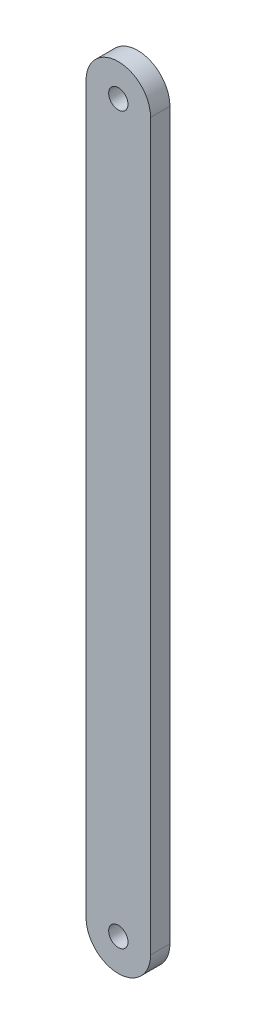
ISO-10303-21;
HEADER;
FILE_DESCRIPTION(('STEP AP214'),'2;1');
FILE_NAME('part.step','',(''),(''),'','','');
FILE_SCHEMA(('AUTOMOTIVE_DESIGN { 1 0 10303 214 1 1 1 1 }'));
ENDSEC;
DATA;
#1=APPLICATION_CONTEXT('core data for automotive mechanical design processes');
#2=APPLICATION_PROTOCOL_DEFINITION('international standard','automotive_design',2000,#1);
#3=PRODUCT_CONTEXT('',#1,'mechanical');
#4=PRODUCT('Part','Part','',(#3));
#5=PRODUCT_RELATED_PRODUCT_CATEGORY('part','',(#4));
#6=PRODUCT_DEFINITION_FORMATION('','',#4);
#7=PRODUCT_DEFINITION_CONTEXT('part definition',#1,'design');
#8=PRODUCT_DEFINITION('design','',#6,#7);
#9=PRODUCT_DEFINITION_SHAPE('','',#8);
#10=(LENGTH_UNIT() NAMED_UNIT(*) SI_UNIT(.MILLI.,.METRE.));
#11=(NAMED_UNIT(*) PLANE_ANGLE_UNIT() SI_UNIT($,.RADIAN.));
#12=(NAMED_UNIT(*) SI_UNIT($,.STERADIAN.) SOLID_ANGLE_UNIT());
#13=UNCERTAINTY_MEASURE_WITH_UNIT(LENGTH_MEASURE(1.E-05),#10,'distance_accuracy_value','');
#14=(GEOMETRIC_REPRESENTATION_CONTEXT(3) GLOBAL_UNCERTAINTY_ASSIGNED_CONTEXT((#13)) GLOBAL_UNIT_ASSIGNED_CONTEXT((#10,
#11,#12)) REPRESENTATION_CONTEXT('',''));
#15=CARTESIAN_POINT('',(0.,0.,0.));
#16=DIRECTION('',(0.,0.,1.));
#17=DIRECTION('',(1.,0.,0.));
#18=AXIS2_PLACEMENT_3D('',#15,#16,#17);
#19=CARTESIAN_POINT('',(0.,0.,6.));
#20=DIRECTION('',(0.,0.,-1.));
#21=DIRECTION('',(-1.,0.,0.));
#22=AXIS2_PLACEMENT_3D('',#19,#20,#21);
#23=CYLINDRICAL_SURFACE('',#22,10.);
#24=CARTESIAN_POINT('',(0.,0.,0.));
#25=DIRECTION('',(0.,0.,1.));
#26=DIRECTION('',(1.,0.,0.));
#27=AXIS2_PLACEMENT_3D('',#24,#25,#26);
#28=CIRCLE('',#27,10.);
#29=CARTESIAN_POINT('',(-10.,0.,0.));
#30=VERTEX_POINT('',#29);
#31=CARTESIAN_POINT('',(10.,0.,0.));
#32=VERTEX_POINT('',#31);
#33=EDGE_CURVE('E96',#30,#32,#28,.T.);
#34=ORIENTED_EDGE('',*,*,#33,.T.);
#35=DIRECTION('',(0.,0.,-1.));
#36=VECTOR('',#35,1.);
#37=CARTESIAN_POINT('',(10.,0.,6.));
#38=LINE('',#37,#36);
#39=CARTESIAN_POINT('',(10.,0.,6.));
#40=VERTEX_POINT('',#39);
#41=EDGE_CURVE('E11',#40,#32,#38,.T.);
#42=ORIENTED_EDGE('',*,*,#41,.F.);
#43=CARTESIAN_POINT('',(0.,0.,6.));
#44=DIRECTION('',(0.,0.,1.));
#45=DIRECTION('',(1.,0.,0.));
#46=AXIS2_PLACEMENT_3D('',#43,#44,#45);
#47=CIRCLE('',#46,10.);
#48=CARTESIAN_POINT('',(-10.,0.,6.));
#49=VERTEX_POINT('',#48);
#50=EDGE_CURVE('E84',#49,#40,#47,.T.);
#51=ORIENTED_EDGE('',*,*,#50,.F.);
#52=DIRECTION('',(0.,0.,-1.));
#53=VECTOR('',#52,1.);
#54=CARTESIAN_POINT('',(-10.,0.,6.));
#55=LINE('',#54,#53);
#56=EDGE_CURVE('E92',#49,#30,#55,.T.);
#57=ORIENTED_EDGE('',*,*,#56,.T.);
#58=EDGE_LOOP('',(#34,#42,#51,#57));
#59=FACE_BOUND('',#58,.T.);
#60=ADVANCED_FACE('F33',(#59),#23,.T.);
#61=CARTESIAN_POINT('',(10.,0.,6.));
#62=DIRECTION('',(-1.,0.,0.));
#63=DIRECTION('',(0.,0.,1.));
#64=AXIS2_PLACEMENT_3D('',#61,#62,#63);
#65=PLANE('',#64);
#66=DIRECTION('',(0.,1.,0.));
#67=VECTOR('',#66,1.);
#68=CARTESIAN_POINT('',(10.,0.,0.));
#69=LINE('',#68,#67);
#70=CARTESIAN_POINT('',(10.,225.,0.));
#71=VERTEX_POINT('',#70);
#72=EDGE_CURVE('E88',#32,#71,#69,.T.);
#73=ORIENTED_EDGE('',*,*,#72,.T.);
#74=DIRECTION('',(0.,0.,-1.));
#75=VECTOR('',#74,1.);
#76=CARTESIAN_POINT('',(10.,225.,6.));
#77=LINE('',#76,#75);
#78=CARTESIAN_POINT('',(10.,225.,6.));
#79=VERTEX_POINT('',#78);
#80=EDGE_CURVE('E41',#79,#71,#77,.T.);
#81=ORIENTED_EDGE('',*,*,#80,.F.);
#82=DIRECTION('',(0.,1.,0.));
#83=VECTOR('',#82,1.);
#84=CARTESIAN_POINT('',(10.,0.,6.));
#85=LINE('',#84,#83);
#86=EDGE_CURVE('E79',#40,#79,#85,.T.);
#87=ORIENTED_EDGE('',*,*,#86,.F.);
#88=ORIENTED_EDGE('',*,*,#41,.T.);
#89=EDGE_LOOP('',(#73,#81,#87,#88));
#90=FACE_BOUND('',#89,.T.);
#91=ADVANCED_FACE('F87',(#90),#65,.F.);
#92=CARTESIAN_POINT('',(0.,225.,6.));
#93=DIRECTION('',(0.,0.,-1.));
#94=DIRECTION('',(-1.,0.,0.));
#95=AXIS2_PLACEMENT_3D('',#92,#93,#94);
#96=CYLINDRICAL_SURFACE('',#95,10.);
#97=CARTESIAN_POINT('',(0.,225.,0.));
#98=DIRECTION('',(0.,0.,1.));
#99=DIRECTION('',(1.,0.,0.));
#100=AXIS2_PLACEMENT_3D('',#97,#98,#99);
#101=CIRCLE('',#100,10.);
#102=CARTESIAN_POINT('',(-10.,225.,0.));
#103=VERTEX_POINT('',#102);
#104=EDGE_CURVE('E66',#71,#103,#101,.T.);
#105=ORIENTED_EDGE('',*,*,#104,.T.);
#106=DIRECTION('',(0.,0.,-1.));
#107=VECTOR('',#106,1.);
#108=CARTESIAN_POINT('',(-10.,225.,6.));
#109=LINE('',#108,#107);
#110=CARTESIAN_POINT('',(-10.,225.,6.));
#111=VERTEX_POINT('',#110);
#112=EDGE_CURVE('E89',#111,#103,#109,.T.);
#113=ORIENTED_EDGE('',*,*,#112,.F.);
#114=CARTESIAN_POINT('',(0.,225.,6.));
#115=DIRECTION('',(0.,0.,1.));
#116=DIRECTION('',(1.,0.,0.));
#117=AXIS2_PLACEMENT_3D('',#114,#115,#116);
#118=CIRCLE('',#117,10.);
#119=EDGE_CURVE('E82',#79,#111,#118,.T.);
#120=ORIENTED_EDGE('',*,*,#119,.F.);
#121=ORIENTED_EDGE('',*,*,#80,.T.);
#122=EDGE_LOOP('',(#105,#113,#120,#121));
#123=FACE_BOUND('',#122,.T.);
#124=ADVANCED_FACE('F90',(#123),#96,.T.);
#125=CARTESIAN_POINT('',(-10.,0.,6.));
#126=DIRECTION('',(1.,0.,0.));
#127=DIRECTION('',(0.,0.,-1.));
#128=AXIS2_PLACEMENT_3D('',#125,#126,#127);
#129=PLANE('',#128);
#130=DIRECTION('',(0.,-1.,0.));
#131=VECTOR('',#130,1.);
#132=CARTESIAN_POINT('',(-10.,0.,0.));
#133=LINE('',#132,#131);
#134=EDGE_CURVE('E72',#103,#30,#133,.T.);
#135=ORIENTED_EDGE('',*,*,#134,.T.);
#136=ORIENTED_EDGE('',*,*,#56,.F.);
#137=DIRECTION('',(0.,-1.,0.));
#138=VECTOR('',#137,1.);
#139=CARTESIAN_POINT('',(-10.,0.,6.));
#140=LINE('',#139,#138);
#141=EDGE_CURVE('E49',#111,#49,#140,.T.);
#142=ORIENTED_EDGE('',*,*,#141,.F.);
#143=ORIENTED_EDGE('',*,*,#112,.T.);
#144=EDGE_LOOP('',(#135,#136,#142,#143));
#145=FACE_BOUND('',#144,.T.);
#146=ADVANCED_FACE('F104',(#145),#129,.F.);
#147=CARTESIAN_POINT('',(0.,0.,6.));
#148=DIRECTION('',(0.,0.,1.));
#149=DIRECTION('',(1.,0.,0.));
#150=AXIS2_PLACEMENT_3D('',#147,#148,#149);
#151=PLANE('',#150);
#152=CARTESIAN_POINT('',(0.,0.,6.));
#153=DIRECTION('',(0.,0.,1.));
#154=DIRECTION('',(1.,0.,0.));
#155=AXIS2_PLACEMENT_3D('',#152,#153,#154);
#156=CIRCLE('',#155,3.);
#157=CARTESIAN_POINT('',(3.,0.,6.));
#158=VERTEX_POINT('',#157);
#159=EDGE_CURVE('E116',#158,#158,#156,.T.);
#160=ORIENTED_EDGE('',*,*,#159,.F.);
#161=EDGE_LOOP('',(#160));
#162=FACE_BOUND('',#161,.T.);
#163=CARTESIAN_POINT('',(0.,225.,6.));
#164=DIRECTION('',(0.,0.,1.));
#165=DIRECTION('',(1.,0.,0.));
#166=AXIS2_PLACEMENT_3D('',#163,#164,#165);
#167=CIRCLE('',#166,3.);
#168=CARTESIAN_POINT('',(3.,225.,6.));
#169=VERTEX_POINT('',#168);
#170=EDGE_CURVE('E110',#169,#169,#167,.T.);
#171=ORIENTED_EDGE('',*,*,#170,.F.);
#172=EDGE_LOOP('',(#171));
#173=FACE_BOUND('',#172,.T.);
#174=ORIENTED_EDGE('',*,*,#50,.T.);
#175=ORIENTED_EDGE('',*,*,#86,.T.);
#176=ORIENTED_EDGE('',*,*,#119,.T.);
#177=ORIENTED_EDGE('',*,*,#141,.T.);
#178=EDGE_LOOP('',(#174,#175,#176,#177));
#179=FACE_BOUND('',#178,.T.);
#180=ADVANCED_FACE('F80',(#162,#173,#179),#151,.T.);
#181=CARTESIAN_POINT('',(0.,0.,0.));
#182=DIRECTION('',(0.,0.,1.));
#183=DIRECTION('',(1.,0.,0.));
#184=AXIS2_PLACEMENT_3D('',#181,#182,#183);
#185=PLANE('',#184);
#186=CARTESIAN_POINT('',(0.,0.,0.));
#187=DIRECTION('',(0.,0.,1.));
#188=DIRECTION('',(1.,0.,0.));
#189=AXIS2_PLACEMENT_3D('',#186,#187,#188);
#190=CIRCLE('',#189,3.);
#191=CARTESIAN_POINT('',(3.,0.,0.));
#192=VERTEX_POINT('',#191);
#193=EDGE_CURVE('E113',#192,#192,#190,.T.);
#194=ORIENTED_EDGE('',*,*,#193,.T.);
#195=EDGE_LOOP('',(#194));
#196=FACE_BOUND('',#195,.T.);
#197=CARTESIAN_POINT('',(0.,225.,0.));
#198=DIRECTION('',(0.,0.,1.));
#199=DIRECTION('',(1.,0.,0.));
#200=AXIS2_PLACEMENT_3D('',#197,#198,#199);
#201=CIRCLE('',#200,3.);
#202=CARTESIAN_POINT('',(3.,225.,0.));
#203=VERTEX_POINT('',#202);
#204=EDGE_CURVE('E99',#203,#203,#201,.T.);
#205=ORIENTED_EDGE('',*,*,#204,.T.);
#206=EDGE_LOOP('',(#205));
#207=FACE_BOUND('',#206,.T.);
#208=ORIENTED_EDGE('',*,*,#33,.F.);
#209=ORIENTED_EDGE('',*,*,#134,.F.);
#210=ORIENTED_EDGE('',*,*,#104,.F.);
#211=ORIENTED_EDGE('',*,*,#72,.F.);
#212=EDGE_LOOP('',(#208,#209,#210,#211));
#213=FACE_BOUND('',#212,.T.);
#214=ADVANCED_FACE('F107',(#196,#207,#213),#185,.F.);
#215=CARTESIAN_POINT('',(0.,225.,0.));
#216=DIRECTION('',(0.,0.,1.));
#217=DIRECTION('',(1.,0.,0.));
#218=AXIS2_PLACEMENT_3D('',#215,#216,#217);
#219=CYLINDRICAL_SURFACE('',#218,3.);
#220=ORIENTED_EDGE('',*,*,#204,.F.);
#221=EDGE_LOOP('',(#220));
#222=FACE_BOUND('',#221,.T.);
#223=ORIENTED_EDGE('',*,*,#170,.T.);
#224=EDGE_LOOP('',(#223));
#225=FACE_BOUND('',#224,.T.);
#226=ADVANCED_FACE('F127',(#222,#225),#219,.F.);
#227=CARTESIAN_POINT('',(0.,0.,0.));
#228=DIRECTION('',(0.,0.,1.));
#229=DIRECTION('',(1.,0.,0.));
#230=AXIS2_PLACEMENT_3D('',#227,#228,#229);
#231=CYLINDRICAL_SURFACE('',#230,3.);
#232=ORIENTED_EDGE('',*,*,#193,.F.);
#233=EDGE_LOOP('',(#232));
#234=FACE_BOUND('',#233,.T.);
#235=ORIENTED_EDGE('',*,*,#159,.T.);
#236=EDGE_LOOP('',(#235));
#237=FACE_BOUND('',#236,.T.);
#238=ADVANCED_FACE('F124',(#234,#237),#231,.F.);
#239=CLOSED_SHELL('',(#60,#91,#124,#146,#180,#214,#226,#238));
#240=MANIFOLD_SOLID_BREP('B2',#239);
#241=ADVANCED_BREP_SHAPE_REPRESENTATION('',(#18,#240),#14);
#242=SHAPE_DEFINITION_REPRESENTATION(#9,#241);
ENDSEC;
END-ISO-10303-21;
